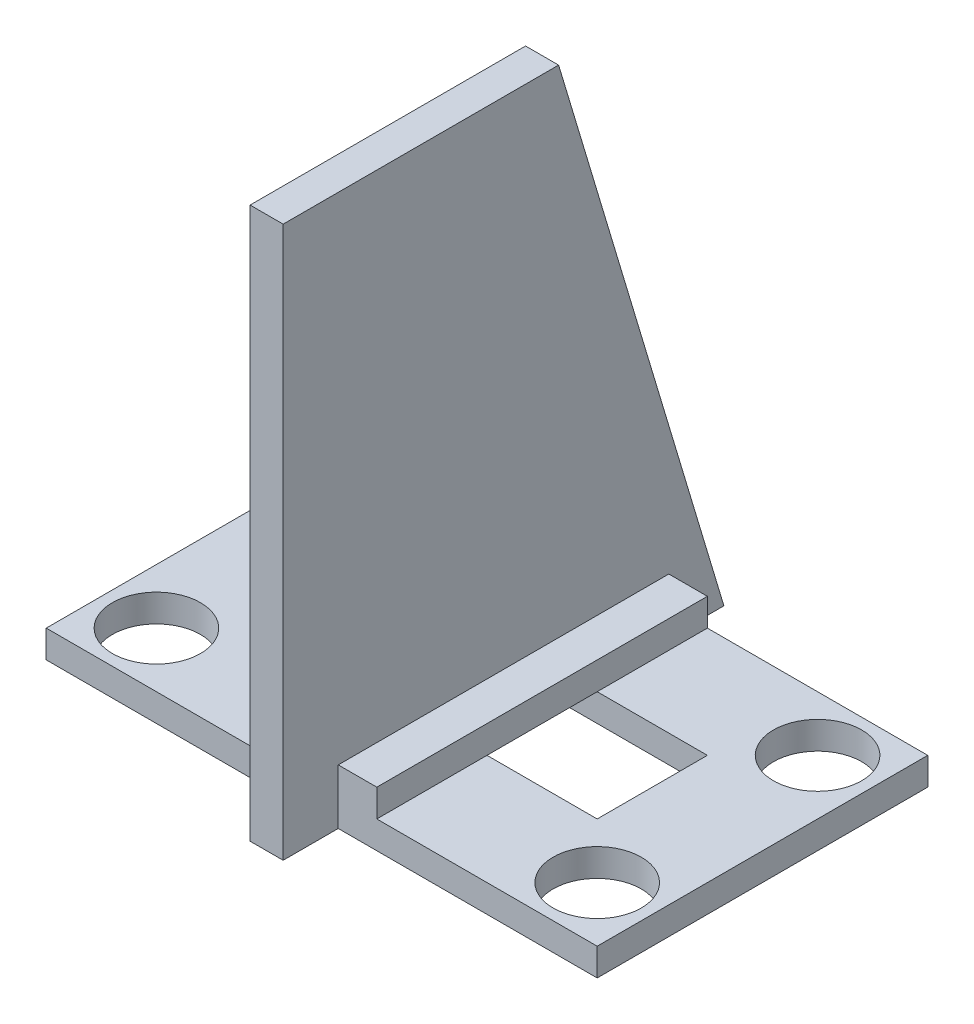
ISO-10303-21;
HEADER;
FILE_DESCRIPTION(('STEP AP214'),'2;1');
FILE_NAME('part.step','',(''),(''),'','','');
FILE_SCHEMA(('AUTOMOTIVE_DESIGN { 1 0 10303 214 1 1 1 1 }'));
ENDSEC;
DATA;
#1=APPLICATION_CONTEXT('core data for automotive mechanical design processes');
#2=APPLICATION_PROTOCOL_DEFINITION('international standard','automotive_design',2000,#1);
#3=PRODUCT_CONTEXT('',#1,'mechanical');
#4=PRODUCT('Part','Part','',(#3));
#5=PRODUCT_RELATED_PRODUCT_CATEGORY('part','',(#4));
#6=PRODUCT_DEFINITION_FORMATION('','',#4);
#7=PRODUCT_DEFINITION_CONTEXT('part definition',#1,'design');
#8=PRODUCT_DEFINITION('design','',#6,#7);
#9=PRODUCT_DEFINITION_SHAPE('','',#8);
#10=(LENGTH_UNIT() NAMED_UNIT(*) SI_UNIT(.MILLI.,.METRE.));
#11=(NAMED_UNIT(*) PLANE_ANGLE_UNIT() SI_UNIT($,.RADIAN.));
#12=(NAMED_UNIT(*) SI_UNIT($,.STERADIAN.) SOLID_ANGLE_UNIT());
#13=UNCERTAINTY_MEASURE_WITH_UNIT(LENGTH_MEASURE(1.E-05),#10,'distance_accuracy_value','');
#14=(GEOMETRIC_REPRESENTATION_CONTEXT(3) GLOBAL_UNCERTAINTY_ASSIGNED_CONTEXT((#13)) GLOBAL_UNIT_ASSIGNED_CONTEXT((#10,
#11,#12)) REPRESENTATION_CONTEXT('',''));
#15=CARTESIAN_POINT('',(0.,0.,0.));
#16=DIRECTION('',(0.,0.,1.));
#17=DIRECTION('',(1.,0.,0.));
#18=AXIS2_PLACEMENT_3D('',#15,#16,#17);
#19=CARTESIAN_POINT('',(0.,2.5,45.));
#20=DIRECTION('',(0.,0.,-1.));
#21=DIRECTION('',(1.,0.,0.));
#22=AXIS2_PLACEMENT_3D('',#19,#20,#21);
#23=PLANE('',#22);
#24=DIRECTION('',(0.,-1.,0.));
#25=VECTOR('',#24,1.);
#26=CARTESIAN_POINT('',(-1.5,2.5,45.));
#27=LINE('',#26,#25);
#28=CARTESIAN_POINT('',(-1.5,5.,45.));
#29=VERTEX_POINT('',#28);
#30=CARTESIAN_POINT('',(-1.5,0.,45.));
#31=VERTEX_POINT('',#30);
#32=EDGE_CURVE('E263',#29,#31,#27,.T.);
#33=ORIENTED_EDGE('',*,*,#32,.F.);
#34=DIRECTION('',(-1.,0.,0.));
#35=VECTOR('',#34,1.);
#36=CARTESIAN_POINT('',(5.,5.,45.));
#37=LINE('',#36,#35);
#38=CARTESIAN_POINT('',(-5.,5.,45.));
#39=VERTEX_POINT('',#38);
#40=EDGE_CURVE('E290',#29,#39,#37,.T.);
#41=ORIENTED_EDGE('',*,*,#40,.T.);
#42=DIRECTION('',(0.,-1.,0.));
#43=VECTOR('',#42,1.);
#44=CARTESIAN_POINT('',(-5.,5.,45.));
#45=LINE('',#44,#43);
#46=CARTESIAN_POINT('',(-5.,2.5,45.));
#47=VERTEX_POINT('',#46);
#48=EDGE_CURVE('E312',#39,#47,#45,.T.);
#49=ORIENTED_EDGE('',*,*,#48,.T.);
#50=DIRECTION('',(-1.,0.,0.));
#51=VECTOR('',#50,1.);
#52=CARTESIAN_POINT('',(0.,2.5,45.));
#53=LINE('',#52,#51);
#54=CARTESIAN_POINT('',(-25.,2.5,45.));
#55=VERTEX_POINT('',#54);
#56=EDGE_CURVE('E359',#47,#55,#53,.T.);
#57=ORIENTED_EDGE('',*,*,#56,.T.);
#58=DIRECTION('',(0.,-1.,0.));
#59=VECTOR('',#58,1.);
#60=CARTESIAN_POINT('',(-25.,2.5,45.));
#61=LINE('',#60,#59);
#62=CARTESIAN_POINT('',(-25.,0.,45.));
#63=VERTEX_POINT('',#62);
#64=EDGE_CURVE('E402',#55,#63,#61,.T.);
#65=ORIENTED_EDGE('',*,*,#64,.T.);
#66=DIRECTION('',(-1.,0.,0.));
#67=VECTOR('',#66,1.);
#68=CARTESIAN_POINT('',(0.,0.,45.));
#69=LINE('',#68,#67);
#70=EDGE_CURVE('E384',#31,#63,#69,.T.);
#71=ORIENTED_EDGE('',*,*,#70,.F.);
#72=EDGE_LOOP('',(#33,#41,#49,#57,#65,#71));
#73=FACE_BOUND('',#72,.T.);
#74=ADVANCED_FACE('F37',(#73),#23,.F.);
#75=CARTESIAN_POINT('',(0.,2.5,15.));
#76=DIRECTION('',(0.,0.,1.));
#77=DIRECTION('',(-1.,0.,0.));
#78=AXIS2_PLACEMENT_3D('',#75,#76,#77);
#79=PLANE('',#78);
#80=DIRECTION('',(0.,1.,0.));
#81=VECTOR('',#80,1.);
#82=CARTESIAN_POINT('',(-1.5,2.5,15.));
#83=LINE('',#82,#81);
#84=CARTESIAN_POINT('',(-1.5,0.,15.));
#85=VERTEX_POINT('',#84);
#86=CARTESIAN_POINT('',(-1.5,5.,15.));
#87=VERTEX_POINT('',#86);
#88=EDGE_CURVE('E233',#85,#87,#83,.T.);
#89=ORIENTED_EDGE('',*,*,#88,.F.);
#90=DIRECTION('',(1.,0.,0.));
#91=VECTOR('',#90,1.);
#92=CARTESIAN_POINT('',(0.,0.,15.));
#93=LINE('',#92,#91);
#94=CARTESIAN_POINT('',(-25.,0.,15.));
#95=VERTEX_POINT('',#94);
#96=EDGE_CURVE('E391',#95,#85,#93,.T.);
#97=ORIENTED_EDGE('',*,*,#96,.F.);
#98=DIRECTION('',(0.,-1.,0.));
#99=VECTOR('',#98,1.);
#100=CARTESIAN_POINT('',(-25.,2.5,15.));
#101=LINE('',#100,#99);
#102=CARTESIAN_POINT('',(-25.,2.5,15.));
#103=VERTEX_POINT('',#102);
#104=EDGE_CURVE('E399',#103,#95,#101,.T.);
#105=ORIENTED_EDGE('',*,*,#104,.F.);
#106=DIRECTION('',(1.,0.,0.));
#107=VECTOR('',#106,1.);
#108=CARTESIAN_POINT('',(0.,2.5,15.));
#109=LINE('',#108,#107);
#110=CARTESIAN_POINT('',(-5.,2.5,15.));
#111=VERTEX_POINT('',#110);
#112=EDGE_CURVE('E367',#103,#111,#109,.T.);
#113=ORIENTED_EDGE('',*,*,#112,.T.);
#114=DIRECTION('',(0.,-1.,0.));
#115=VECTOR('',#114,1.);
#116=CARTESIAN_POINT('',(-5.,5.,15.));
#117=LINE('',#116,#115);
#118=CARTESIAN_POINT('',(-5.,5.,15.));
#119=VERTEX_POINT('',#118);
#120=EDGE_CURVE('E315',#119,#111,#117,.T.);
#121=ORIENTED_EDGE('',*,*,#120,.F.);
#122=DIRECTION('',(-1.,0.,0.));
#123=VECTOR('',#122,1.);
#124=CARTESIAN_POINT('',(5.,5.,15.));
#125=LINE('',#124,#123);
#126=EDGE_CURVE('E287',#87,#119,#125,.T.);
#127=ORIENTED_EDGE('',*,*,#126,.F.);
#128=EDGE_LOOP('',(#89,#97,#105,#113,#121,#127));
#129=FACE_BOUND('',#128,.T.);
#130=ADVANCED_FACE('F470',(#129),#79,.F.);
#131=CARTESIAN_POINT('',(-15.,-2.5,25.));
#132=DIRECTION('',(0.,0.,-1.));
#133=DIRECTION('',(1.,0.,0.));
#134=AXIS2_PLACEMENT_3D('',#131,#132,#133);
#135=PLANE('',#134);
#136=DIRECTION('',(0.,-1.,0.));
#137=VECTOR('',#136,1.);
#138=CARTESIAN_POINT('',(-1.5,-2.5,25.));
#139=LINE('',#138,#137);
#140=CARTESIAN_POINT('',(-1.5,2.5,25.));
#141=VERTEX_POINT('',#140);
#142=CARTESIAN_POINT('',(-1.5,0.,25.));
#143=VERTEX_POINT('',#142);
#144=EDGE_CURVE('E271',#141,#143,#139,.T.);
#145=ORIENTED_EDGE('',*,*,#144,.F.);
#146=DIRECTION('',(1.,0.,0.));
#147=VECTOR('',#146,1.);
#148=CARTESIAN_POINT('',(-15.,2.5,25.));
#149=LINE('',#148,#147);
#150=CARTESIAN_POINT('',(-5.,2.5,25.));
#151=VERTEX_POINT('',#150);
#152=EDGE_CURVE('E334',#151,#141,#149,.T.);
#153=ORIENTED_EDGE('',*,*,#152,.F.);
#154=CARTESIAN_POINT('',(-15.,2.5,25.));
#155=VERTEX_POINT('',#154);
#156=EDGE_CURVE('E331',#155,#151,#149,.T.);
#157=ORIENTED_EDGE('',*,*,#156,.F.);
#158=DIRECTION('',(0.,1.,0.));
#159=VECTOR('',#158,1.);
#160=CARTESIAN_POINT('',(-15.,-2.5,25.));
#161=LINE('',#160,#159);
#162=CARTESIAN_POINT('',(-15.,0.,25.));
#163=VERTEX_POINT('',#162);
#164=EDGE_CURVE('E340',#163,#155,#161,.T.);
#165=ORIENTED_EDGE('',*,*,#164,.F.);
#166=DIRECTION('',(1.,0.,0.));
#167=VECTOR('',#166,1.);
#168=CARTESIAN_POINT('',(0.,0.,25.));
#169=LINE('',#168,#167);
#170=EDGE_CURVE('E60',#163,#143,#169,.T.);
#171=ORIENTED_EDGE('',*,*,#170,.T.);
#172=EDGE_LOOP('',(#145,#153,#157,#165,#171));
#173=FACE_BOUND('',#172,.T.);
#174=ADVANCED_FACE('F481',(#173),#135,.F.);
#175=CARTESIAN_POINT('',(-15.,-2.5,35.));
#176=DIRECTION('',(0.,0.,1.));
#177=DIRECTION('',(-1.,0.,0.));
#178=AXIS2_PLACEMENT_3D('',#175,#176,#177);
#179=PLANE('',#178);
#180=DIRECTION('',(0.,1.,0.));
#181=VECTOR('',#180,1.);
#182=CARTESIAN_POINT('',(-1.5,-2.5,35.));
#183=LINE('',#182,#181);
#184=CARTESIAN_POINT('',(-1.5,0.,35.));
#185=VERTEX_POINT('',#184);
#186=CARTESIAN_POINT('',(-1.5,2.5,35.));
#187=VERTEX_POINT('',#186);
#188=EDGE_CURVE('E268',#185,#187,#183,.T.);
#189=ORIENTED_EDGE('',*,*,#188,.F.);
#190=DIRECTION('',(-1.,0.,0.));
#191=VECTOR('',#190,1.);
#192=CARTESIAN_POINT('',(0.,0.,35.));
#193=LINE('',#192,#191);
#194=CARTESIAN_POINT('',(-15.,0.,35.));
#195=VERTEX_POINT('',#194);
#196=EDGE_CURVE('E405',#185,#195,#193,.T.);
#197=ORIENTED_EDGE('',*,*,#196,.T.);
#198=DIRECTION('',(0.,1.,0.));
#199=VECTOR('',#198,1.);
#200=CARTESIAN_POINT('',(-15.,-2.5,35.));
#201=LINE('',#200,#199);
#202=CARTESIAN_POINT('',(-15.,2.5,35.));
#203=VERTEX_POINT('',#202);
#204=EDGE_CURVE('E342',#195,#203,#201,.T.);
#205=ORIENTED_EDGE('',*,*,#204,.T.);
#206=DIRECTION('',(-1.,0.,0.));
#207=VECTOR('',#206,1.);
#208=CARTESIAN_POINT('',(-15.,2.5,35.));
#209=LINE('',#208,#207);
#210=CARTESIAN_POINT('',(-5.,2.5,35.));
#211=VERTEX_POINT('',#210);
#212=EDGE_CURVE('E321',#211,#203,#209,.T.);
#213=ORIENTED_EDGE('',*,*,#212,.F.);
#214=EDGE_CURVE('E327',#187,#211,#209,.T.);
#215=ORIENTED_EDGE('',*,*,#214,.F.);
#216=EDGE_LOOP('',(#189,#197,#205,#213,#215));
#217=FACE_BOUND('',#216,.T.);
#218=ADVANCED_FACE('F501',(#217),#179,.F.);
#219=CARTESIAN_POINT('',(0.,2.5,0.));
#220=DIRECTION('',(0.,1.,0.));
#221=DIRECTION('',(0.,0.,1.));
#222=AXIS2_PLACEMENT_3D('',#219,#220,#221);
#223=PLANE('',#222);
#224=DIRECTION('',(0.,0.,-1.));
#225=VECTOR('',#224,1.);
#226=CARTESIAN_POINT('',(-1.5,2.5,0.));
#227=LINE('',#226,#225);
#228=EDGE_CURVE('E265',#187,#141,#227,.T.);
#229=ORIENTED_EDGE('',*,*,#228,.F.);
#230=ORIENTED_EDGE('',*,*,#214,.T.);
#231=DIRECTION('',(0.,0.,1.));
#232=VECTOR('',#231,1.);
#233=CARTESIAN_POINT('',(-5.,2.5,15.));
#234=LINE('',#233,#232);
#235=EDGE_CURVE('E282',#151,#211,#234,.T.);
#236=ORIENTED_EDGE('',*,*,#235,.F.);
#237=ORIENTED_EDGE('',*,*,#152,.T.);
#238=EDGE_LOOP('',(#229,#230,#236,#237));
#239=FACE_BOUND('',#238,.T.);
#240=ADVANCED_FACE('F486',(#239),#223,.F.);
#241=CARTESIAN_POINT('',(0.,5.,0.));
#242=DIRECTION('',(0.,1.,0.));
#243=DIRECTION('',(0.,0.,1.));
#244=AXIS2_PLACEMENT_3D('',#241,#242,#243);
#245=PLANE('',#244);
#246=ORIENTED_EDGE('',*,*,#40,.F.);
#247=DIRECTION('',(0.,0.,-1.));
#248=VECTOR('',#247,1.);
#249=CARTESIAN_POINT('',(-1.5,5.,0.));
#250=LINE('',#249,#248);
#251=EDGE_CURVE('E45',#29,#87,#250,.T.);
#252=ORIENTED_EDGE('',*,*,#251,.T.);
#253=ORIENTED_EDGE('',*,*,#126,.T.);
#254=DIRECTION('',(0.,0.,1.));
#255=VECTOR('',#254,1.);
#256=CARTESIAN_POINT('',(-5.,5.,15.));
#257=LINE('',#256,#255);
#258=EDGE_CURVE('E286',#119,#39,#257,.T.);
#259=ORIENTED_EDGE('',*,*,#258,.T.);
#260=EDGE_LOOP('',(#246,#252,#253,#259));
#261=FACE_BOUND('',#260,.T.);
#262=ADVANCED_FACE('F509',(#261),#245,.T.);
#263=CARTESIAN_POINT('',(0.,2.5,30.));
#264=DIRECTION('',(0.,1.,0.));
#265=DIRECTION('',(0.,0.,-1.));
#266=AXIS2_PLACEMENT_3D('',#263,#264,#265);
#267=PLANE('',#266);
#268=CARTESIAN_POINT('',(20.,2.5,20.));
#269=DIRECTION('',(0.,-1.,0.));
#270=DIRECTION('',(0.,0.,-1.));
#271=AXIS2_PLACEMENT_3D('',#268,#269,#270);
#272=CIRCLE('',#271,4.);
#273=CARTESIAN_POINT('',(20.,2.5,16.));
#274=VERTEX_POINT('',#273);
#275=EDGE_CURVE('E349',#274,#274,#272,.T.);
#276=ORIENTED_EDGE('',*,*,#275,.T.);
#277=EDGE_LOOP('',(#276));
#278=FACE_BOUND('',#277,.T.);
#279=CARTESIAN_POINT('',(20.,2.5,40.));
#280=DIRECTION('',(0.,-1.,0.));
#281=DIRECTION('',(0.,0.,-1.));
#282=AXIS2_PLACEMENT_3D('',#279,#280,#281);
#283=CIRCLE('',#282,4.);
#284=CARTESIAN_POINT('',(20.,2.5,36.));
#285=VERTEX_POINT('',#284);
#286=EDGE_CURVE('E346',#285,#285,#283,.T.);
#287=ORIENTED_EDGE('',*,*,#286,.T.);
#288=EDGE_LOOP('',(#287));
#289=FACE_BOUND('',#288,.T.);
#290=CARTESIAN_POINT('',(5.,2.5,15.));
#291=VERTEX_POINT('',#290);
#292=CARTESIAN_POINT('',(25.,2.5,15.));
#293=VERTEX_POINT('',#292);
#294=EDGE_CURVE('E366',#291,#293,#109,.T.);
#295=ORIENTED_EDGE('',*,*,#294,.F.);
#296=DIRECTION('',(0.,0.,1.));
#297=VECTOR('',#296,1.);
#298=CARTESIAN_POINT('',(5.,2.5,15.));
#299=LINE('',#298,#297);
#300=CARTESIAN_POINT('',(5.,2.5,25.));
#301=VERTEX_POINT('',#300);
#302=EDGE_CURVE('E303',#291,#301,#299,.T.);
#303=ORIENTED_EDGE('',*,*,#302,.T.);
#304=CARTESIAN_POINT('',(15.,2.5,25.));
#305=VERTEX_POINT('',#304);
#306=EDGE_CURVE('E330',#301,#305,#149,.T.);
#307=ORIENTED_EDGE('',*,*,#306,.T.);
#308=DIRECTION('',(0.,0.,1.));
#309=VECTOR('',#308,1.);
#310=CARTESIAN_POINT('',(15.,2.5,35.));
#311=LINE('',#310,#309);
#312=CARTESIAN_POINT('',(15.,2.5,35.));
#313=VERTEX_POINT('',#312);
#314=EDGE_CURVE('E318',#305,#313,#311,.T.);
#315=ORIENTED_EDGE('',*,*,#314,.T.);
#316=CARTESIAN_POINT('',(5.,2.5,35.));
#317=VERTEX_POINT('',#316);
#318=EDGE_CURVE('E322',#313,#317,#209,.T.);
#319=ORIENTED_EDGE('',*,*,#318,.T.);
#320=CARTESIAN_POINT('',(5.,2.5,45.));
#321=VERTEX_POINT('',#320);
#322=EDGE_CURVE('E306',#317,#321,#299,.T.);
#323=ORIENTED_EDGE('',*,*,#322,.T.);
#324=CARTESIAN_POINT('',(25.,2.5,45.));
#325=VERTEX_POINT('',#324);
#326=EDGE_CURVE('E360',#325,#321,#53,.T.);
#327=ORIENTED_EDGE('',*,*,#326,.F.);
#328=DIRECTION('',(0.,0.,1.));
#329=VECTOR('',#328,1.);
#330=CARTESIAN_POINT('',(25.,2.5,30.));
#331=LINE('',#330,#329);
#332=EDGE_CURVE('E370',#293,#325,#331,.T.);
#333=ORIENTED_EDGE('',*,*,#332,.F.);
#334=EDGE_LOOP('',(#295,#303,#307,#315,#319,#323,#327,#333));
#335=FACE_BOUND('',#334,.T.);
#336=ADVANCED_FACE('F526',(#278,#289,#335),#267,.T.);
#337=CARTESIAN_POINT('',(5.,5.,45.));
#338=VERTEX_POINT('',#337);
#339=CARTESIAN_POINT('',(1.5,5.,45.));
#340=VERTEX_POINT('',#339);
#341=EDGE_CURVE('E291',#338,#340,#37,.T.);
#342=ORIENTED_EDGE('',*,*,#341,.T.);
#343=DIRECTION('',(0.,-1.,0.));
#344=VECTOR('',#343,1.);
#345=CARTESIAN_POINT('',(1.5,2.5,45.));
#346=LINE('',#345,#344);
#347=CARTESIAN_POINT('',(1.5,0.,45.));
#348=VERTEX_POINT('',#347);
#349=EDGE_CURVE('E274',#340,#348,#346,.T.);
#350=ORIENTED_EDGE('',*,*,#349,.T.);
#351=CARTESIAN_POINT('',(25.,0.,45.));
#352=VERTEX_POINT('',#351);
#353=EDGE_CURVE('E385',#352,#348,#69,.T.);
#354=ORIENTED_EDGE('',*,*,#353,.F.);
#355=DIRECTION('',(0.,-1.,0.));
#356=VECTOR('',#355,1.);
#357=CARTESIAN_POINT('',(25.,2.5,45.));
#358=LINE('',#357,#356);
#359=EDGE_CURVE('E372',#325,#352,#358,.T.);
#360=ORIENTED_EDGE('',*,*,#359,.F.);
#361=ORIENTED_EDGE('',*,*,#326,.T.);
#362=DIRECTION('',(0.,-1.,0.));
#363=VECTOR('',#362,1.);
#364=CARTESIAN_POINT('',(5.,5.,45.));
#365=LINE('',#364,#363);
#366=EDGE_CURVE('E309',#338,#321,#365,.T.);
#367=ORIENTED_EDGE('',*,*,#366,.F.);
#368=EDGE_LOOP('',(#342,#350,#354,#360,#361,#367));
#369=FACE_BOUND('',#368,.T.);
#370=ADVANCED_FACE('F435',(#369),#23,.F.);
#371=CARTESIAN_POINT('',(-25.,2.5,30.));
#372=DIRECTION('',(1.,0.,0.));
#373=DIRECTION('',(0.,0.,1.));
#374=AXIS2_PLACEMENT_3D('',#371,#372,#373);
#375=PLANE('',#374);
#376=DIRECTION('',(0.,0.,-1.));
#377=VECTOR('',#376,1.);
#378=CARTESIAN_POINT('',(-25.,0.,30.));
#379=LINE('',#378,#377);
#380=EDGE_CURVE('E387',#63,#95,#379,.T.);
#381=ORIENTED_EDGE('',*,*,#380,.F.);
#382=ORIENTED_EDGE('',*,*,#64,.F.);
#383=DIRECTION('',(0.,0.,-1.));
#384=VECTOR('',#383,1.);
#385=CARTESIAN_POINT('',(-25.,2.5,30.));
#386=LINE('',#385,#384);
#387=EDGE_CURVE('E363',#55,#103,#386,.T.);
#388=ORIENTED_EDGE('',*,*,#387,.T.);
#389=ORIENTED_EDGE('',*,*,#104,.T.);
#390=EDGE_LOOP('',(#381,#382,#388,#389));
#391=FACE_BOUND('',#390,.T.);
#392=ADVANCED_FACE('F466',(#391),#375,.F.);
#393=CARTESIAN_POINT('',(1.5,0.,15.));
#394=VERTEX_POINT('',#393);
#395=CARTESIAN_POINT('',(25.,0.,15.));
#396=VERTEX_POINT('',#395);
#397=EDGE_CURVE('E390',#394,#396,#93,.T.);
#398=ORIENTED_EDGE('',*,*,#397,.F.);
#399=DIRECTION('',(0.,1.,0.));
#400=VECTOR('',#399,1.);
#401=CARTESIAN_POINT('',(1.5,2.5,15.));
#402=LINE('',#401,#400);
#403=CARTESIAN_POINT('',(1.5,5.,15.));
#404=VERTEX_POINT('',#403);
#405=EDGE_CURVE('E217',#394,#404,#402,.T.);
#406=ORIENTED_EDGE('',*,*,#405,.T.);
#407=CARTESIAN_POINT('',(5.,5.,15.));
#408=VERTEX_POINT('',#407);
#409=EDGE_CURVE('E283',#408,#404,#125,.T.);
#410=ORIENTED_EDGE('',*,*,#409,.F.);
#411=DIRECTION('',(0.,-1.,0.));
#412=VECTOR('',#411,1.);
#413=CARTESIAN_POINT('',(5.,5.,15.));
#414=LINE('',#413,#412);
#415=EDGE_CURVE('E297',#408,#291,#414,.T.);
#416=ORIENTED_EDGE('',*,*,#415,.T.);
#417=ORIENTED_EDGE('',*,*,#294,.T.);
#418=DIRECTION('',(0.,-1.,0.));
#419=VECTOR('',#418,1.);
#420=CARTESIAN_POINT('',(25.,2.5,15.));
#421=LINE('',#420,#419);
#422=EDGE_CURVE('E396',#293,#396,#421,.T.);
#423=ORIENTED_EDGE('',*,*,#422,.T.);
#424=EDGE_LOOP('',(#398,#406,#410,#416,#417,#423));
#425=FACE_BOUND('',#424,.T.);
#426=ADVANCED_FACE('F442',(#425),#79,.F.);
#427=CARTESIAN_POINT('',(-20.,2.5,20.));
#428=DIRECTION('',(0.,-1.,0.));
#429=DIRECTION('',(0.,0.,1.));
#430=AXIS2_PLACEMENT_3D('',#427,#428,#429);
#431=CYLINDRICAL_SURFACE('',#430,4.);
#432=CARTESIAN_POINT('',(-20.,2.5,20.));
#433=DIRECTION('',(0.,-1.,0.));
#434=DIRECTION('',(0.,0.,-1.));
#435=AXIS2_PLACEMENT_3D('',#432,#433,#434);
#436=CIRCLE('',#435,4.);
#437=CARTESIAN_POINT('',(-20.,2.5,16.));
#438=VERTEX_POINT('',#437);
#439=EDGE_CURVE('E356',#438,#438,#436,.T.);
#440=ORIENTED_EDGE('',*,*,#439,.F.);
#441=EDGE_LOOP('',(#440));
#442=FACE_BOUND('',#441,.T.);
#443=CARTESIAN_POINT('',(-20.,0.,20.));
#444=DIRECTION('',(0.,-1.,0.));
#445=DIRECTION('',(0.,0.,-1.));
#446=AXIS2_PLACEMENT_3D('',#443,#444,#445);
#447=CIRCLE('',#446,4.);
#448=CARTESIAN_POINT('',(-20.,0.,16.));
#449=VERTEX_POINT('',#448);
#450=EDGE_CURVE('E381',#449,#449,#447,.T.);
#451=ORIENTED_EDGE('',*,*,#450,.T.);
#452=EDGE_LOOP('',(#451));
#453=FACE_BOUND('',#452,.T.);
#454=ADVANCED_FACE('F553',(#442,#453),#431,.F.);
#455=CARTESIAN_POINT('',(-20.,2.5,40.));
#456=DIRECTION('',(0.,-1.,0.));
#457=DIRECTION('',(0.,0.,1.));
#458=AXIS2_PLACEMENT_3D('',#455,#456,#457);
#459=CYLINDRICAL_SURFACE('',#458,4.);
#460=CARTESIAN_POINT('',(-20.,2.5,40.));
#461=DIRECTION('',(0.,-1.,0.));
#462=DIRECTION('',(0.,0.,-1.));
#463=AXIS2_PLACEMENT_3D('',#460,#461,#462);
#464=CIRCLE('',#463,4.);
#465=CARTESIAN_POINT('',(-20.,2.5,36.));
#466=VERTEX_POINT('',#465);
#467=EDGE_CURVE('E353',#466,#466,#464,.T.);
#468=ORIENTED_EDGE('',*,*,#467,.F.);
#469=EDGE_LOOP('',(#468));
#470=FACE_BOUND('',#469,.T.);
#471=CARTESIAN_POINT('',(-20.,0.,40.));
#472=DIRECTION('',(0.,-1.,0.));
#473=DIRECTION('',(0.,0.,-1.));
#474=AXIS2_PLACEMENT_3D('',#471,#472,#473);
#475=CIRCLE('',#474,4.);
#476=CARTESIAN_POINT('',(-20.,0.,36.));
#477=VERTEX_POINT('',#476);
#478=EDGE_CURVE('E378',#477,#477,#475,.T.);
#479=ORIENTED_EDGE('',*,*,#478,.T.);
#480=EDGE_LOOP('',(#479));
#481=FACE_BOUND('',#480,.T.);
#482=ADVANCED_FACE('F557',(#470,#481),#459,.F.);
#483=CARTESIAN_POINT('',(20.,2.5,20.));
#484=DIRECTION('',(0.,-1.,0.));
#485=DIRECTION('',(0.,0.,1.));
#486=AXIS2_PLACEMENT_3D('',#483,#484,#485);
#487=CYLINDRICAL_SURFACE('',#486,4.);
#488=ORIENTED_EDGE('',*,*,#275,.F.);
#489=EDGE_LOOP('',(#488));
#490=FACE_BOUND('',#489,.T.);
#491=CARTESIAN_POINT('',(20.,0.,20.));
#492=DIRECTION('',(0.,-1.,0.));
#493=DIRECTION('',(0.,0.,-1.));
#494=AXIS2_PLACEMENT_3D('',#491,#492,#493);
#495=CIRCLE('',#494,4.);
#496=CARTESIAN_POINT('',(20.,0.,16.));
#497=VERTEX_POINT('',#496);
#498=EDGE_CURVE('E375',#497,#497,#495,.T.);
#499=ORIENTED_EDGE('',*,*,#498,.T.);
#500=EDGE_LOOP('',(#499));
#501=FACE_BOUND('',#500,.T.);
#502=ADVANCED_FACE('F550',(#490,#501),#487,.F.);
#503=CARTESIAN_POINT('',(20.,2.5,40.));
#504=DIRECTION('',(0.,-1.,0.));
#505=DIRECTION('',(0.,0.,1.));
#506=AXIS2_PLACEMENT_3D('',#503,#504,#505);
#507=CYLINDRICAL_SURFACE('',#506,4.);
#508=ORIENTED_EDGE('',*,*,#286,.F.);
#509=EDGE_LOOP('',(#508));
#510=FACE_BOUND('',#509,.T.);
#511=CARTESIAN_POINT('',(20.,0.,40.));
#512=DIRECTION('',(0.,-1.,0.));
#513=DIRECTION('',(0.,0.,-1.));
#514=AXIS2_PLACEMENT_3D('',#511,#512,#513);
#515=CIRCLE('',#514,4.);
#516=CARTESIAN_POINT('',(20.,0.,36.));
#517=VERTEX_POINT('',#516);
#518=EDGE_CURVE('E339',#517,#517,#515,.T.);
#519=ORIENTED_EDGE('',*,*,#518,.T.);
#520=EDGE_LOOP('',(#519));
#521=FACE_BOUND('',#520,.T.);
#522=ADVANCED_FACE('F39',(#510,#521),#507,.F.);
#523=CARTESIAN_POINT('',(25.,2.5,30.));
#524=DIRECTION('',(-1.,0.,0.));
#525=DIRECTION('',(0.,0.,-1.));
#526=AXIS2_PLACEMENT_3D('',#523,#524,#525);
#527=PLANE('',#526);
#528=DIRECTION('',(0.,0.,1.));
#529=VECTOR('',#528,1.);
#530=CARTESIAN_POINT('',(25.,0.,30.));
#531=LINE('',#530,#529);
#532=EDGE_CURVE('E350',#396,#352,#531,.T.);
#533=ORIENTED_EDGE('',*,*,#532,.F.);
#534=ORIENTED_EDGE('',*,*,#422,.F.);
#535=ORIENTED_EDGE('',*,*,#332,.T.);
#536=ORIENTED_EDGE('',*,*,#359,.T.);
#537=EDGE_LOOP('',(#533,#534,#535,#536));
#538=FACE_BOUND('',#537,.T.);
#539=ADVANCED_FACE('F446',(#538),#527,.F.);
#540=EDGE_CURVE('E298',#111,#151,#234,.T.);
#541=ORIENTED_EDGE('',*,*,#540,.F.);
#542=ORIENTED_EDGE('',*,*,#112,.F.);
#543=ORIENTED_EDGE('',*,*,#387,.F.);
#544=ORIENTED_EDGE('',*,*,#56,.F.);
#545=EDGE_CURVE('E302',#211,#47,#234,.T.);
#546=ORIENTED_EDGE('',*,*,#545,.F.);
#547=ORIENTED_EDGE('',*,*,#212,.T.);
#548=DIRECTION('',(0.,0.,-1.));
#549=VECTOR('',#548,1.);
#550=CARTESIAN_POINT('',(-15.,2.5,35.));
#551=LINE('',#550,#549);
#552=EDGE_CURVE('E325',#203,#155,#551,.T.);
#553=ORIENTED_EDGE('',*,*,#552,.T.);
#554=ORIENTED_EDGE('',*,*,#156,.T.);
#555=EDGE_LOOP('',(#541,#542,#543,#544,#546,#547,#553,#554));
#556=FACE_BOUND('',#555,.T.);
#557=ORIENTED_EDGE('',*,*,#467,.T.);
#558=EDGE_LOOP('',(#557));
#559=FACE_BOUND('',#558,.T.);
#560=ORIENTED_EDGE('',*,*,#439,.T.);
#561=EDGE_LOOP('',(#560));
#562=FACE_BOUND('',#561,.T.);
#563=ADVANCED_FACE('F493',(#556,#559,#562),#267,.T.);
#564=CARTESIAN_POINT('',(0.,0.,30.));
#565=DIRECTION('',(0.,1.,0.));
#566=DIRECTION('',(0.,0.,-1.));
#567=AXIS2_PLACEMENT_3D('',#564,#565,#566);
#568=PLANE('',#567);
#569=DIRECTION('',(0.,0.,-1.));
#570=VECTOR('',#569,1.);
#571=CARTESIAN_POINT('',(1.5,0.,45.));
#572=LINE('',#571,#570);
#573=CARTESIAN_POINT('',(1.5,0.,35.));
#574=VERTEX_POINT('',#573);
#575=CARTESIAN_POINT('',(1.5,0.,25.));
#576=VERTEX_POINT('',#575);
#577=EDGE_CURVE('E220',#574,#576,#572,.T.);
#578=ORIENTED_EDGE('',*,*,#577,.F.);
#579=CARTESIAN_POINT('',(15.,0.,35.));
#580=VERTEX_POINT('',#579);
#581=EDGE_CURVE('E406',#580,#574,#193,.T.);
#582=ORIENTED_EDGE('',*,*,#581,.F.);
#583=DIRECTION('',(0.,0.,1.));
#584=VECTOR('',#583,1.);
#585=CARTESIAN_POINT('',(15.,0.,30.));
#586=LINE('',#585,#584);
#587=CARTESIAN_POINT('',(15.,0.,25.));
#588=VERTEX_POINT('',#587);
#589=EDGE_CURVE('E413',#588,#580,#586,.T.);
#590=ORIENTED_EDGE('',*,*,#589,.F.);
#591=EDGE_CURVE('E411',#576,#588,#169,.T.);
#592=ORIENTED_EDGE('',*,*,#591,.F.);
#593=EDGE_LOOP('',(#578,#582,#590,#592));
#594=FACE_BOUND('',#593,.T.);
#595=ORIENTED_EDGE('',*,*,#353,.T.);
#596=CARTESIAN_POINT('',(1.5,0.,50.));
#597=VERTEX_POINT('',#596);
#598=EDGE_CURVE('E223',#597,#348,#572,.T.);
#599=ORIENTED_EDGE('',*,*,#598,.F.);
#600=DIRECTION('',(-1.,0.,0.));
#601=VECTOR('',#600,1.);
#602=CARTESIAN_POINT('',(1.5,0.,50.));
#603=LINE('',#602,#601);
#604=CARTESIAN_POINT('',(-1.5,0.,50.));
#605=VERTEX_POINT('',#604);
#606=EDGE_CURVE('E245',#597,#605,#603,.T.);
#607=ORIENTED_EDGE('',*,*,#606,.T.);
#608=DIRECTION('',(0.,0.,-1.));
#609=VECTOR('',#608,1.);
#610=CARTESIAN_POINT('',(-1.5,0.,15.));
#611=LINE('',#610,#609);
#612=EDGE_CURVE('E246',#605,#31,#611,.T.);
#613=ORIENTED_EDGE('',*,*,#612,.T.);
#614=ORIENTED_EDGE('',*,*,#70,.T.);
#615=ORIENTED_EDGE('',*,*,#380,.T.);
#616=ORIENTED_EDGE('',*,*,#96,.T.);
#617=CARTESIAN_POINT('',(-1.5,0.,10.));
#618=VERTEX_POINT('',#617);
#619=EDGE_CURVE('E230',#85,#618,#611,.T.);
#620=ORIENTED_EDGE('',*,*,#619,.T.);
#621=DIRECTION('',(-1.,0.,0.));
#622=VECTOR('',#621,1.);
#623=CARTESIAN_POINT('',(1.5,0.,10.));
#624=LINE('',#623,#622);
#625=CARTESIAN_POINT('',(1.5,0.,10.));
#626=VERTEX_POINT('',#625);
#627=EDGE_CURVE('E225',#626,#618,#624,.T.);
#628=ORIENTED_EDGE('',*,*,#627,.F.);
#629=EDGE_CURVE('E210',#394,#626,#572,.T.);
#630=ORIENTED_EDGE('',*,*,#629,.F.);
#631=ORIENTED_EDGE('',*,*,#397,.T.);
#632=ORIENTED_EDGE('',*,*,#532,.T.);
#633=EDGE_LOOP('',(#595,#599,#607,#613,#614,#615,#616,#620,#628,#630,#631,#632));
#634=FACE_BOUND('',#633,.T.);
#635=ORIENTED_EDGE('',*,*,#518,.F.);
#636=EDGE_LOOP('',(#635));
#637=FACE_BOUND('',#636,.T.);
#638=ORIENTED_EDGE('',*,*,#498,.F.);
#639=EDGE_LOOP('',(#638));
#640=FACE_BOUND('',#639,.T.);
#641=ORIENTED_EDGE('',*,*,#196,.F.);
#642=EDGE_CURVE('E250',#185,#143,#611,.T.);
#643=ORIENTED_EDGE('',*,*,#642,.T.);
#644=ORIENTED_EDGE('',*,*,#170,.F.);
#645=DIRECTION('',(0.,0.,-1.));
#646=VECTOR('',#645,1.);
#647=CARTESIAN_POINT('',(-15.,0.,30.));
#648=LINE('',#647,#646);
#649=EDGE_CURVE('E408',#195,#163,#648,.T.);
#650=ORIENTED_EDGE('',*,*,#649,.F.);
#651=EDGE_LOOP('',(#641,#643,#644,#650));
#652=FACE_BOUND('',#651,.T.);
#653=ORIENTED_EDGE('',*,*,#450,.F.);
#654=EDGE_LOOP('',(#653));
#655=FACE_BOUND('',#654,.T.);
#656=ORIENTED_EDGE('',*,*,#478,.F.);
#657=EDGE_LOOP('',(#656));
#658=FACE_BOUND('',#657,.T.);
#659=ADVANCED_FACE('F227',(#594,#634,#637,#640,#652,#655,#658),#568,.F.);
#660=CARTESIAN_POINT('',(15.,-2.5,35.));
#661=DIRECTION('',(1.,0.,0.));
#662=DIRECTION('',(0.,0.,1.));
#663=AXIS2_PLACEMENT_3D('',#660,#661,#662);
#664=PLANE('',#663);
#665=DIRECTION('',(0.,1.,0.));
#666=VECTOR('',#665,1.);
#667=CARTESIAN_POINT('',(15.,-2.5,25.));
#668=LINE('',#667,#666);
#669=EDGE_CURVE('E336',#588,#305,#668,.T.);
#670=ORIENTED_EDGE('',*,*,#669,.F.);
#671=ORIENTED_EDGE('',*,*,#589,.T.);
#672=DIRECTION('',(0.,1.,0.));
#673=VECTOR('',#672,1.);
#674=CARTESIAN_POINT('',(15.,-2.5,35.));
#675=LINE('',#674,#673);
#676=EDGE_CURVE('E333',#580,#313,#675,.T.);
#677=ORIENTED_EDGE('',*,*,#676,.T.);
#678=ORIENTED_EDGE('',*,*,#314,.F.);
#679=EDGE_LOOP('',(#670,#671,#677,#678));
#680=FACE_BOUND('',#679,.T.);
#681=ADVANCED_FACE('F544',(#680),#664,.F.);
#682=CARTESIAN_POINT('',(1.5,2.5,25.));
#683=VERTEX_POINT('',#682);
#684=EDGE_CURVE('E335',#683,#301,#149,.T.);
#685=ORIENTED_EDGE('',*,*,#684,.F.);
#686=DIRECTION('',(0.,-1.,0.));
#687=VECTOR('',#686,1.);
#688=CARTESIAN_POINT('',(1.5,-2.5,25.));
#689=LINE('',#688,#687);
#690=EDGE_CURVE('E52',#683,#576,#689,.T.);
#691=ORIENTED_EDGE('',*,*,#690,.T.);
#692=ORIENTED_EDGE('',*,*,#591,.T.);
#693=ORIENTED_EDGE('',*,*,#669,.T.);
#694=ORIENTED_EDGE('',*,*,#306,.F.);
#695=EDGE_LOOP('',(#685,#691,#692,#693,#694));
#696=FACE_BOUND('',#695,.T.);
#697=ADVANCED_FACE('F512',(#696),#135,.F.);
#698=CARTESIAN_POINT('',(-15.,-2.5,35.));
#699=DIRECTION('',(-1.,0.,0.));
#700=DIRECTION('',(0.,0.,-1.));
#701=AXIS2_PLACEMENT_3D('',#698,#699,#700);
#702=PLANE('',#701);
#703=ORIENTED_EDGE('',*,*,#204,.F.);
#704=ORIENTED_EDGE('',*,*,#649,.T.);
#705=ORIENTED_EDGE('',*,*,#164,.T.);
#706=ORIENTED_EDGE('',*,*,#552,.F.);
#707=EDGE_LOOP('',(#703,#704,#705,#706));
#708=FACE_BOUND('',#707,.T.);
#709=ADVANCED_FACE('F499',(#708),#702,.F.);
#710=ORIENTED_EDGE('',*,*,#581,.T.);
#711=DIRECTION('',(0.,1.,0.));
#712=VECTOR('',#711,1.);
#713=CARTESIAN_POINT('',(1.5,-2.5,35.));
#714=LINE('',#713,#712);
#715=CARTESIAN_POINT('',(1.5,2.5,35.));
#716=VERTEX_POINT('',#715);
#717=EDGE_CURVE('E279',#574,#716,#714,.T.);
#718=ORIENTED_EDGE('',*,*,#717,.T.);
#719=EDGE_CURVE('E326',#317,#716,#209,.T.);
#720=ORIENTED_EDGE('',*,*,#719,.F.);
#721=ORIENTED_EDGE('',*,*,#318,.F.);
#722=ORIENTED_EDGE('',*,*,#676,.F.);
#723=EDGE_LOOP('',(#710,#718,#720,#721,#722));
#724=FACE_BOUND('',#723,.T.);
#725=ADVANCED_FACE('F504',(#724),#179,.F.);
#726=ORIENTED_EDGE('',*,*,#719,.T.);
#727=DIRECTION('',(0.,0.,-1.));
#728=VECTOR('',#727,1.);
#729=CARTESIAN_POINT('',(1.5,2.5,0.));
#730=LINE('',#729,#728);
#731=EDGE_CURVE('E277',#716,#683,#730,.T.);
#732=ORIENTED_EDGE('',*,*,#731,.T.);
#733=ORIENTED_EDGE('',*,*,#684,.T.);
#734=EDGE_CURVE('E301',#301,#317,#299,.T.);
#735=ORIENTED_EDGE('',*,*,#734,.T.);
#736=EDGE_LOOP('',(#726,#732,#733,#735));
#737=FACE_BOUND('',#736,.T.);
#738=ADVANCED_FACE('F427',(#737),#223,.F.);
#739=CARTESIAN_POINT('',(-5.,5.,15.));
#740=DIRECTION('',(1.,0.,0.));
#741=DIRECTION('',(0.,0.,-1.));
#742=AXIS2_PLACEMENT_3D('',#739,#740,#741);
#743=PLANE('',#742);
#744=ORIENTED_EDGE('',*,*,#540,.T.);
#745=ORIENTED_EDGE('',*,*,#235,.T.);
#746=ORIENTED_EDGE('',*,*,#545,.T.);
#747=ORIENTED_EDGE('',*,*,#48,.F.);
#748=ORIENTED_EDGE('',*,*,#258,.F.);
#749=ORIENTED_EDGE('',*,*,#120,.T.);
#750=EDGE_LOOP('',(#744,#745,#746,#747,#748,#749));
#751=FACE_BOUND('',#750,.T.);
#752=ADVANCED_FACE('F490',(#751),#743,.F.);
#753=CARTESIAN_POINT('',(5.,5.,15.));
#754=DIRECTION('',(1.,0.,0.));
#755=DIRECTION('',(0.,0.,-1.));
#756=AXIS2_PLACEMENT_3D('',#753,#754,#755);
#757=PLANE('',#756);
#758=ORIENTED_EDGE('',*,*,#302,.F.);
#759=ORIENTED_EDGE('',*,*,#415,.F.);
#760=DIRECTION('',(0.,0.,1.));
#761=VECTOR('',#760,1.);
#762=CARTESIAN_POINT('',(5.,5.,15.));
#763=LINE('',#762,#761);
#764=EDGE_CURVE('E294',#408,#338,#763,.T.);
#765=ORIENTED_EDGE('',*,*,#764,.T.);
#766=ORIENTED_EDGE('',*,*,#366,.T.);
#767=ORIENTED_EDGE('',*,*,#322,.F.);
#768=ORIENTED_EDGE('',*,*,#734,.F.);
#769=EDGE_LOOP('',(#758,#759,#765,#766,#767,#768));
#770=FACE_BOUND('',#769,.T.);
#771=ADVANCED_FACE('F431',(#770),#757,.T.);
#772=DIRECTION('',(0.,0.,-1.));
#773=VECTOR('',#772,1.);
#774=CARTESIAN_POINT('',(1.5,5.,0.));
#775=LINE('',#774,#773);
#776=EDGE_CURVE('E11',#340,#404,#775,.T.);
#777=ORIENTED_EDGE('',*,*,#776,.F.);
#778=ORIENTED_EDGE('',*,*,#341,.F.);
#779=ORIENTED_EDGE('',*,*,#764,.F.);
#780=ORIENTED_EDGE('',*,*,#409,.T.);
#781=EDGE_LOOP('',(#777,#778,#779,#780));
#782=FACE_BOUND('',#781,.T.);
#783=ADVANCED_FACE('F439',(#782),#245,.T.);
#784=CARTESIAN_POINT('',(1.5,50.,50.));
#785=DIRECTION('',(0.,0.,-1.));
#786=DIRECTION('',(0.,1.,0.));
#787=AXIS2_PLACEMENT_3D('',#784,#785,#786);
#788=PLANE('',#787);
#789=DIRECTION('',(0.,-1.,0.));
#790=VECTOR('',#789,1.);
#791=CARTESIAN_POINT('',(-1.5,50.,50.));
#792=LINE('',#791,#790);
#793=CARTESIAN_POINT('',(-1.5,50.,50.));
#794=VERTEX_POINT('',#793);
#795=EDGE_CURVE('E221',#794,#605,#792,.T.);
#796=ORIENTED_EDGE('',*,*,#795,.T.);
#797=ORIENTED_EDGE('',*,*,#606,.F.);
#798=DIRECTION('',(0.,-1.,0.));
#799=VECTOR('',#798,1.);
#800=CARTESIAN_POINT('',(1.5,50.,50.));
#801=LINE('',#800,#799);
#802=CARTESIAN_POINT('',(1.5,50.,50.));
#803=VERTEX_POINT('',#802);
#804=EDGE_CURVE('E241',#803,#597,#801,.T.);
#805=ORIENTED_EDGE('',*,*,#804,.F.);
#806=DIRECTION('',(-1.,0.,0.));
#807=VECTOR('',#806,1.);
#808=CARTESIAN_POINT('',(1.5,50.,50.));
#809=LINE('',#808,#807);
#810=EDGE_CURVE('E258',#803,#794,#809,.T.);
#811=ORIENTED_EDGE('',*,*,#810,.T.);
#812=EDGE_LOOP('',(#796,#797,#805,#811));
#813=FACE_BOUND('',#812,.T.);
#814=ADVANCED_FACE('F454',(#813),#788,.F.);
#815=CARTESIAN_POINT('',(1.5,50.,50.));
#816=DIRECTION('',(0.,-1.,0.));
#817=DIRECTION('',(0.,0.,-1.));
#818=AXIS2_PLACEMENT_3D('',#815,#816,#817);
#819=PLANE('',#818);
#820=DIRECTION('',(0.,0.,1.));
#821=VECTOR('',#820,1.);
#822=CARTESIAN_POINT('',(-1.5,50.,50.));
#823=LINE('',#822,#821);
#824=CARTESIAN_POINT('',(-1.5,50.,25.));
#825=VERTEX_POINT('',#824);
#826=EDGE_CURVE('E252',#825,#794,#823,.T.);
#827=ORIENTED_EDGE('',*,*,#826,.T.);
#828=ORIENTED_EDGE('',*,*,#810,.F.);
#829=DIRECTION('',(0.,0.,1.));
#830=VECTOR('',#829,1.);
#831=CARTESIAN_POINT('',(1.5,50.,50.));
#832=LINE('',#831,#830);
#833=CARTESIAN_POINT('',(1.5,50.,25.));
#834=VERTEX_POINT('',#833);
#835=EDGE_CURVE('E239',#834,#803,#832,.T.);
#836=ORIENTED_EDGE('',*,*,#835,.F.);
#837=DIRECTION('',(-1.,0.,0.));
#838=VECTOR('',#837,1.);
#839=CARTESIAN_POINT('',(1.5,50.,25.));
#840=LINE('',#839,#838);
#841=EDGE_CURVE('E234',#834,#825,#840,.T.);
#842=ORIENTED_EDGE('',*,*,#841,.T.);
#843=EDGE_LOOP('',(#827,#828,#836,#842));
#844=FACE_BOUND('',#843,.T.);
#845=ADVANCED_FACE('F715',(#844),#819,.F.);
#846=CARTESIAN_POINT('',(1.5,50.,25.));
#847=DIRECTION('',(0.,-0.287347885566345,0.957826285221151));
#848=DIRECTION('',(0.,-0.957826285221152,-0.287347885566345));
#849=AXIS2_PLACEMENT_3D('',#846,#847,#848);
#850=PLANE('',#849);
#851=DIRECTION('',(0.,0.957826285221151,0.287347885566345));
#852=VECTOR('',#851,1.);
#853=CARTESIAN_POINT('',(-1.5,50.,25.));
#854=LINE('',#853,#852);
#855=EDGE_CURVE('E249',#618,#825,#854,.T.);
#856=ORIENTED_EDGE('',*,*,#855,.T.);
#857=ORIENTED_EDGE('',*,*,#841,.F.);
#858=DIRECTION('',(0.,0.957826285221151,0.287347885566345));
#859=VECTOR('',#858,1.);
#860=CARTESIAN_POINT('',(1.5,50.,25.));
#861=LINE('',#860,#859);
#862=EDGE_CURVE('E214',#626,#834,#861,.T.);
#863=ORIENTED_EDGE('',*,*,#862,.F.);
#864=ORIENTED_EDGE('',*,*,#627,.T.);
#865=EDGE_LOOP('',(#856,#857,#863,#864));
#866=FACE_BOUND('',#865,.T.);
#867=ADVANCED_FACE('F236',(#866),#850,.F.);
#868=CARTESIAN_POINT('',(-1.5,0.,0.));
#869=DIRECTION('',(1.,0.,0.));
#870=DIRECTION('',(0.,0.,-1.));
#871=AXIS2_PLACEMENT_3D('',#868,#869,#870);
#872=PLANE('',#871);
#873=ORIENTED_EDGE('',*,*,#251,.F.);
#874=ORIENTED_EDGE('',*,*,#32,.T.);
#875=ORIENTED_EDGE('',*,*,#612,.F.);
#876=ORIENTED_EDGE('',*,*,#795,.F.);
#877=ORIENTED_EDGE('',*,*,#826,.F.);
#878=ORIENTED_EDGE('',*,*,#855,.F.);
#879=ORIENTED_EDGE('',*,*,#619,.F.);
#880=ORIENTED_EDGE('',*,*,#88,.T.);
#881=EDGE_LOOP('',(#873,#874,#875,#876,#877,#878,#879,#880));
#882=FACE_BOUND('',#881,.T.);
#883=ADVANCED_FACE('F458',(#882),#872,.F.);
#884=CARTESIAN_POINT('',(1.5,0.,0.));
#885=DIRECTION('',(1.,0.,0.));
#886=DIRECTION('',(0.,0.,-1.));
#887=AXIS2_PLACEMENT_3D('',#884,#885,#886);
#888=PLANE('',#887);
#889=ORIENTED_EDGE('',*,*,#349,.F.);
#890=ORIENTED_EDGE('',*,*,#776,.T.);
#891=ORIENTED_EDGE('',*,*,#405,.F.);
#892=ORIENTED_EDGE('',*,*,#629,.T.);
#893=ORIENTED_EDGE('',*,*,#862,.T.);
#894=ORIENTED_EDGE('',*,*,#835,.T.);
#895=ORIENTED_EDGE('',*,*,#804,.T.);
#896=ORIENTED_EDGE('',*,*,#598,.T.);
#897=EDGE_LOOP('',(#889,#890,#891,#892,#893,#894,#895,#896));
#898=FACE_BOUND('',#897,.T.);
#899=ADVANCED_FACE('F212',(#898),#888,.T.);
#900=ORIENTED_EDGE('',*,*,#690,.F.);
#901=ORIENTED_EDGE('',*,*,#731,.F.);
#902=ORIENTED_EDGE('',*,*,#717,.F.);
#903=ORIENTED_EDGE('',*,*,#577,.T.);
#904=EDGE_LOOP('',(#900,#901,#902,#903));
#905=FACE_BOUND('',#904,.T.);
#906=ADVANCED_FACE('F749',(#905),#888,.T.);
#907=ORIENTED_EDGE('',*,*,#228,.T.);
#908=ORIENTED_EDGE('',*,*,#144,.T.);
#909=ORIENTED_EDGE('',*,*,#642,.F.);
#910=ORIENTED_EDGE('',*,*,#188,.T.);
#911=EDGE_LOOP('',(#907,#908,#909,#910));
#912=FACE_BOUND('',#911,.T.);
#913=ADVANCED_FACE('F479',(#912),#872,.F.);
#914=CLOSED_SHELL('',(#74,#130,#174,#218,#240,#262,#336,#370,#392,#426,#454,#482,#502,#522,#539,
#563,#659,#681,#697,#709,#725,#738,#752,#771,#783,#814,#845,#867,#883,#899,#906,#913));
#915=MANIFOLD_SOLID_BREP('B2',#914);
#916=ADVANCED_BREP_SHAPE_REPRESENTATION('',(#18,#915),#14);
#917=SHAPE_DEFINITION_REPRESENTATION(#9,#916);
ENDSEC;
END-ISO-10303-21;
